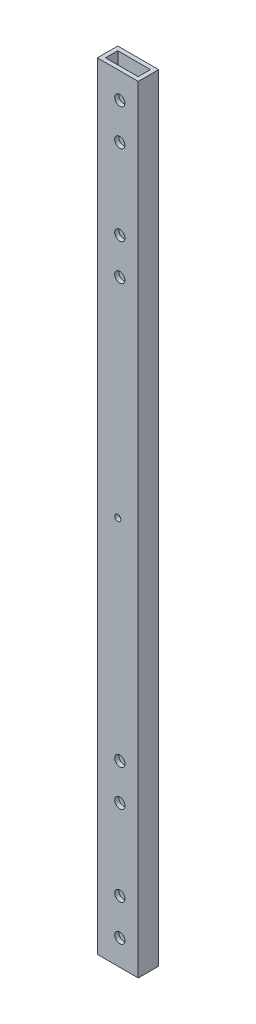
ISO-10303-21;
HEADER;
FILE_DESCRIPTION(('STEP AP214'),'2;1');
FILE_NAME('part.step','',(''),(''),'','','');
FILE_SCHEMA(('AUTOMOTIVE_DESIGN { 1 0 10303 214 1 1 1 1 }'));
ENDSEC;
DATA;
#1=APPLICATION_CONTEXT('core data for automotive mechanical design processes');
#2=APPLICATION_PROTOCOL_DEFINITION('international standard','automotive_design',2000,#1);
#3=PRODUCT_CONTEXT('',#1,'mechanical');
#4=PRODUCT('Part','Part','',(#3));
#5=PRODUCT_RELATED_PRODUCT_CATEGORY('part','',(#4));
#6=PRODUCT_DEFINITION_FORMATION('','',#4);
#7=PRODUCT_DEFINITION_CONTEXT('part definition',#1,'design');
#8=PRODUCT_DEFINITION('design','',#6,#7);
#9=PRODUCT_DEFINITION_SHAPE('','',#8);
#10=(LENGTH_UNIT() NAMED_UNIT(*) SI_UNIT(.MILLI.,.METRE.));
#11=(NAMED_UNIT(*) PLANE_ANGLE_UNIT() SI_UNIT($,.RADIAN.));
#12=(NAMED_UNIT(*) SI_UNIT($,.STERADIAN.) SOLID_ANGLE_UNIT());
#13=UNCERTAINTY_MEASURE_WITH_UNIT(LENGTH_MEASURE(1.E-05),#10,'distance_accuracy_value','');
#14=(GEOMETRIC_REPRESENTATION_CONTEXT(3) GLOBAL_UNCERTAINTY_ASSIGNED_CONTEXT((#13)) GLOBAL_UNIT_ASSIGNED_CONTEXT((#10,
#11,#12)) REPRESENTATION_CONTEXT('',''));
#15=CARTESIAN_POINT('',(0.,0.,0.));
#16=DIRECTION('',(0.,0.,1.));
#17=DIRECTION('',(1.,0.,0.));
#18=AXIS2_PLACEMENT_3D('',#15,#16,#17);
#19=CARTESIAN_POINT('',(0.,190.,0.));
#20=DIRECTION('',(0.,1.,0.));
#21=DIRECTION('',(0.,0.,1.));
#22=AXIS2_PLACEMENT_3D('',#19,#20,#21);
#23=PLANE('',#22);
#24=DIRECTION('',(0.,0.,1.));
#25=VECTOR('',#24,1.);
#26=CARTESIAN_POINT('',(-10.,190.,5.));
#27=LINE('',#26,#25);
#28=CARTESIAN_POINT('',(-10.,190.,-5.));
#29=VERTEX_POINT('',#28);
#30=CARTESIAN_POINT('',(-10.,190.,5.));
#31=VERTEX_POINT('',#30);
#32=EDGE_CURVE('E141',#29,#31,#27,.T.);
#33=ORIENTED_EDGE('',*,*,#32,.T.);
#34=DIRECTION('',(1.,0.,0.));
#35=VECTOR('',#34,1.);
#36=CARTESIAN_POINT('',(10.,190.,5.));
#37=LINE('',#36,#35);
#38=CARTESIAN_POINT('',(10.,190.,5.));
#39=VERTEX_POINT('',#38);
#40=EDGE_CURVE('E144',#31,#39,#37,.T.);
#41=ORIENTED_EDGE('',*,*,#40,.T.);
#42=DIRECTION('',(0.,0.,-1.));
#43=VECTOR('',#42,1.);
#44=CARTESIAN_POINT('',(10.,190.,5.));
#45=LINE('',#44,#43);
#46=CARTESIAN_POINT('',(10.,190.,-5.));
#47=VERTEX_POINT('',#46);
#48=EDGE_CURVE('E147',#39,#47,#45,.T.);
#49=ORIENTED_EDGE('',*,*,#48,.T.);
#50=DIRECTION('',(-1.,0.,0.));
#51=VECTOR('',#50,1.);
#52=CARTESIAN_POINT('',(10.,190.,-5.));
#53=LINE('',#52,#51);
#54=EDGE_CURVE('E149',#47,#29,#53,.T.);
#55=ORIENTED_EDGE('',*,*,#54,.T.);
#56=EDGE_LOOP('',(#33,#41,#49,#55));
#57=FACE_BOUND('',#56,.T.);
#58=DIRECTION('',(-1.,0.,0.));
#59=VECTOR('',#58,1.);
#60=CARTESIAN_POINT('',(8.,190.,-3.));
#61=LINE('',#60,#59);
#62=CARTESIAN_POINT('',(8.,190.,-3.));
#63=VERTEX_POINT('',#62);
#64=CARTESIAN_POINT('',(-8.,190.,-3.));
#65=VERTEX_POINT('',#64);
#66=EDGE_CURVE('E111',#63,#65,#61,.T.);
#67=ORIENTED_EDGE('',*,*,#66,.F.);
#68=DIRECTION('',(0.,0.,-1.));
#69=VECTOR('',#68,1.);
#70=CARTESIAN_POINT('',(8.,190.,3.));
#71=LINE('',#70,#69);
#72=CARTESIAN_POINT('',(8.,190.,3.));
#73=VERTEX_POINT('',#72);
#74=EDGE_CURVE('E103',#73,#63,#71,.T.);
#75=ORIENTED_EDGE('',*,*,#74,.F.);
#76=DIRECTION('',(1.,0.,0.));
#77=VECTOR('',#76,1.);
#78=CARTESIAN_POINT('',(8.,190.,3.));
#79=LINE('',#78,#77);
#80=CARTESIAN_POINT('',(-8.,190.,3.));
#81=VERTEX_POINT('',#80);
#82=EDGE_CURVE('E125',#81,#73,#79,.T.);
#83=ORIENTED_EDGE('',*,*,#82,.F.);
#84=DIRECTION('',(0.,0.,1.));
#85=VECTOR('',#84,1.);
#86=CARTESIAN_POINT('',(-8.,190.,3.));
#87=LINE('',#86,#85);
#88=EDGE_CURVE('E123',#65,#81,#87,.T.);
#89=ORIENTED_EDGE('',*,*,#88,.F.);
#90=EDGE_LOOP('',(#67,#75,#83,#89));
#91=FACE_BOUND('',#90,.T.);
#92=ADVANCED_FACE('F36',(#57,#91),#23,.T.);
#93=CARTESIAN_POINT('',(0.,-190.,0.));
#94=DIRECTION('',(0.,1.,0.));
#95=DIRECTION('',(0.,0.,1.));
#96=AXIS2_PLACEMENT_3D('',#93,#94,#95);
#97=PLANE('',#96);
#98=DIRECTION('',(0.,0.,1.));
#99=VECTOR('',#98,1.);
#100=CARTESIAN_POINT('',(-10.,-190.,5.));
#101=LINE('',#100,#99);
#102=CARTESIAN_POINT('',(-10.,-190.,-5.));
#103=VERTEX_POINT('',#102);
#104=CARTESIAN_POINT('',(-10.,-190.,5.));
#105=VERTEX_POINT('',#104);
#106=EDGE_CURVE('E119',#103,#105,#101,.T.);
#107=ORIENTED_EDGE('',*,*,#106,.F.);
#108=DIRECTION('',(-1.,0.,0.));
#109=VECTOR('',#108,1.);
#110=CARTESIAN_POINT('',(10.,-190.,-5.));
#111=LINE('',#110,#109);
#112=CARTESIAN_POINT('',(10.,-190.,-5.));
#113=VERTEX_POINT('',#112);
#114=EDGE_CURVE('E145',#113,#103,#111,.T.);
#115=ORIENTED_EDGE('',*,*,#114,.F.);
#116=DIRECTION('',(0.,0.,-1.));
#117=VECTOR('',#116,1.);
#118=CARTESIAN_POINT('',(10.,-190.,5.));
#119=LINE('',#118,#117);
#120=CARTESIAN_POINT('',(10.,-190.,5.));
#121=VERTEX_POINT('',#120);
#122=EDGE_CURVE('E156',#121,#113,#119,.T.);
#123=ORIENTED_EDGE('',*,*,#122,.F.);
#124=DIRECTION('',(1.,0.,0.));
#125=VECTOR('',#124,1.);
#126=CARTESIAN_POINT('',(10.,-190.,5.));
#127=LINE('',#126,#125);
#128=EDGE_CURVE('E154',#105,#121,#127,.T.);
#129=ORIENTED_EDGE('',*,*,#128,.F.);
#130=EDGE_LOOP('',(#107,#115,#123,#129));
#131=FACE_BOUND('',#130,.T.);
#132=DIRECTION('',(0.,0.,-1.));
#133=VECTOR('',#132,1.);
#134=CARTESIAN_POINT('',(8.,-190.,3.));
#135=LINE('',#134,#133);
#136=CARTESIAN_POINT('',(8.,-190.,3.));
#137=VERTEX_POINT('',#136);
#138=CARTESIAN_POINT('',(8.,-190.,-3.));
#139=VERTEX_POINT('',#138);
#140=EDGE_CURVE('E61',#137,#139,#135,.T.);
#141=ORIENTED_EDGE('',*,*,#140,.T.);
#142=DIRECTION('',(-1.,0.,0.));
#143=VECTOR('',#142,1.);
#144=CARTESIAN_POINT('',(8.,-190.,-3.));
#145=LINE('',#144,#143);
#146=CARTESIAN_POINT('',(-8.,-190.,-3.));
#147=VERTEX_POINT('',#146);
#148=EDGE_CURVE('E118',#139,#147,#145,.T.);
#149=ORIENTED_EDGE('',*,*,#148,.T.);
#150=DIRECTION('',(0.,0.,1.));
#151=VECTOR('',#150,1.);
#152=CARTESIAN_POINT('',(-8.,-190.,3.));
#153=LINE('',#152,#151);
#154=CARTESIAN_POINT('',(-8.,-190.,3.));
#155=VERTEX_POINT('',#154);
#156=EDGE_CURVE('E133',#147,#155,#153,.T.);
#157=ORIENTED_EDGE('',*,*,#156,.T.);
#158=DIRECTION('',(1.,0.,0.));
#159=VECTOR('',#158,1.);
#160=CARTESIAN_POINT('',(8.,-190.,3.));
#161=LINE('',#160,#159);
#162=EDGE_CURVE('E112',#155,#137,#161,.T.);
#163=ORIENTED_EDGE('',*,*,#162,.T.);
#164=EDGE_LOOP('',(#141,#149,#157,#163));
#165=FACE_BOUND('',#164,.T.);
#166=ADVANCED_FACE('F286',(#131,#165),#97,.F.);
#167=CARTESIAN_POINT('',(-10.,190.,5.));
#168=DIRECTION('',(1.,0.,0.));
#169=DIRECTION('',(0.,0.,-1.));
#170=AXIS2_PLACEMENT_3D('',#167,#168,#169);
#171=PLANE('',#170);
#172=ORIENTED_EDGE('',*,*,#106,.T.);
#173=DIRECTION('',(0.,-1.,0.));
#174=VECTOR('',#173,1.);
#175=CARTESIAN_POINT('',(-10.,190.,5.));
#176=LINE('',#175,#174);
#177=EDGE_CURVE('E11',#31,#105,#176,.T.);
#178=ORIENTED_EDGE('',*,*,#177,.F.);
#179=ORIENTED_EDGE('',*,*,#32,.F.);
#180=DIRECTION('',(0.,-1.,0.));
#181=VECTOR('',#180,1.);
#182=CARTESIAN_POINT('',(-10.,190.,-5.));
#183=LINE('',#182,#181);
#184=EDGE_CURVE('E151',#29,#103,#183,.T.);
#185=ORIENTED_EDGE('',*,*,#184,.T.);
#186=EDGE_LOOP('',(#172,#178,#179,#185));
#187=FACE_BOUND('',#186,.T.);
#188=ADVANCED_FACE('F38',(#187),#171,.F.);
#189=CARTESIAN_POINT('',(10.,190.,5.));
#190=DIRECTION('',(0.,0.,-1.));
#191=DIRECTION('',(-1.,0.,0.));
#192=AXIS2_PLACEMENT_3D('',#189,#190,#191);
#193=PLANE('',#192);
#194=CARTESIAN_POINT('',(0.,0.,5.));
#195=DIRECTION('',(0.,0.,-1.));
#196=DIRECTION('',(-1.,0.,0.));
#197=AXIS2_PLACEMENT_3D('',#194,#195,#196);
#198=CIRCLE('',#197,1.5);
#199=CARTESIAN_POINT('',(-1.5,0.,5.));
#200=VERTEX_POINT('',#199);
#201=EDGE_CURVE('E311',#200,#200,#198,.T.);
#202=ORIENTED_EDGE('',*,*,#201,.T.);
#203=EDGE_LOOP('',(#202));
#204=FACE_BOUND('',#203,.T.);
#205=CARTESIAN_POINT('',(1.,177.5,5.));
#206=DIRECTION('',(0.,0.,1.));
#207=DIRECTION('',(-1.,0.,0.));
#208=AXIS2_PLACEMENT_3D('',#205,#206,#207);
#209=CIRCLE('',#208,2.5);
#210=CARTESIAN_POINT('',(-1.5,177.5,5.));
#211=VERTEX_POINT('',#210);
#212=EDGE_CURVE('E209',#211,#211,#209,.T.);
#213=ORIENTED_EDGE('',*,*,#212,.F.);
#214=EDGE_LOOP('',(#213));
#215=FACE_BOUND('',#214,.T.);
#216=CARTESIAN_POINT('',(1.,159.7,5.));
#217=DIRECTION('',(0.,0.,1.));
#218=DIRECTION('',(-1.,0.,0.));
#219=AXIS2_PLACEMENT_3D('',#216,#217,#218);
#220=CIRCLE('',#219,2.5);
#221=CARTESIAN_POINT('',(-1.5,159.7,5.));
#222=VERTEX_POINT('',#221);
#223=EDGE_CURVE('E206',#222,#222,#220,.T.);
#224=ORIENTED_EDGE('',*,*,#223,.F.);
#225=EDGE_LOOP('',(#224));
#226=FACE_BOUND('',#225,.T.);
#227=CARTESIAN_POINT('',(1.,120.3,5.));
#228=DIRECTION('',(0.,0.,1.));
#229=DIRECTION('',(-1.,0.,0.));
#230=AXIS2_PLACEMENT_3D('',#227,#228,#229);
#231=CIRCLE('',#230,2.5);
#232=CARTESIAN_POINT('',(-1.5,120.3,5.));
#233=VERTEX_POINT('',#232);
#234=EDGE_CURVE('E225',#233,#233,#231,.T.);
#235=ORIENTED_EDGE('',*,*,#234,.F.);
#236=EDGE_LOOP('',(#235));
#237=FACE_BOUND('',#236,.T.);
#238=CARTESIAN_POINT('',(1.,102.5,5.));
#239=DIRECTION('',(0.,0.,1.));
#240=DIRECTION('',(-1.,0.,0.));
#241=AXIS2_PLACEMENT_3D('',#238,#239,#240);
#242=CIRCLE('',#241,2.5);
#243=CARTESIAN_POINT('',(-1.5,102.5,5.));
#244=VERTEX_POINT('',#243);
#245=EDGE_CURVE('E232',#244,#244,#242,.T.);
#246=ORIENTED_EDGE('',*,*,#245,.F.);
#247=EDGE_LOOP('',(#246));
#248=FACE_BOUND('',#247,.T.);
#249=CARTESIAN_POINT('',(1.,-102.5,5.));
#250=DIRECTION('',(0.,0.,1.));
#251=DIRECTION('',(1.,0.,0.));
#252=AXIS2_PLACEMENT_3D('',#249,#250,#251);
#253=CIRCLE('',#252,2.5);
#254=CARTESIAN_POINT('',(3.50000000000001,-102.5,5.));
#255=VERTEX_POINT('',#254);
#256=EDGE_CURVE('E239',#255,#255,#253,.T.);
#257=ORIENTED_EDGE('',*,*,#256,.F.);
#258=EDGE_LOOP('',(#257));
#259=FACE_BOUND('',#258,.T.);
#260=CARTESIAN_POINT('',(1.,-120.3,5.));
#261=DIRECTION('',(0.,0.,1.));
#262=DIRECTION('',(1.,0.,0.));
#263=AXIS2_PLACEMENT_3D('',#260,#261,#262);
#264=CIRCLE('',#263,2.5);
#265=CARTESIAN_POINT('',(3.50000000000001,-120.3,5.));
#266=VERTEX_POINT('',#265);
#267=EDGE_CURVE('E246',#266,#266,#264,.T.);
#268=ORIENTED_EDGE('',*,*,#267,.F.);
#269=EDGE_LOOP('',(#268));
#270=FACE_BOUND('',#269,.T.);
#271=CARTESIAN_POINT('',(1.,-159.7,5.));
#272=DIRECTION('',(0.,0.,1.));
#273=DIRECTION('',(1.,0.,0.));
#274=AXIS2_PLACEMENT_3D('',#271,#272,#273);
#275=CIRCLE('',#274,2.5);
#276=CARTESIAN_POINT('',(3.50000000000001,-159.7,5.));
#277=VERTEX_POINT('',#276);
#278=EDGE_CURVE('E253',#277,#277,#275,.T.);
#279=ORIENTED_EDGE('',*,*,#278,.F.);
#280=EDGE_LOOP('',(#279));
#281=FACE_BOUND('',#280,.T.);
#282=CARTESIAN_POINT('',(1.,-177.5,5.));
#283=DIRECTION('',(0.,0.,1.));
#284=DIRECTION('',(1.,0.,0.));
#285=AXIS2_PLACEMENT_3D('',#282,#283,#284);
#286=CIRCLE('',#285,2.5);
#287=CARTESIAN_POINT('',(3.50000000000001,-177.5,5.));
#288=VERTEX_POINT('',#287);
#289=EDGE_CURVE('E260',#288,#288,#286,.T.);
#290=ORIENTED_EDGE('',*,*,#289,.F.);
#291=EDGE_LOOP('',(#290));
#292=FACE_BOUND('',#291,.T.);
#293=ORIENTED_EDGE('',*,*,#128,.T.);
#294=DIRECTION('',(0.,-1.,0.));
#295=VECTOR('',#294,1.);
#296=CARTESIAN_POINT('',(10.,190.,5.));
#297=LINE('',#296,#295);
#298=EDGE_CURVE('E45',#39,#121,#297,.T.);
#299=ORIENTED_EDGE('',*,*,#298,.F.);
#300=ORIENTED_EDGE('',*,*,#40,.F.);
#301=ORIENTED_EDGE('',*,*,#177,.T.);
#302=EDGE_LOOP('',(#293,#299,#300,#301));
#303=FACE_BOUND('',#302,.T.);
#304=ADVANCED_FACE('F300',(#204,#215,#226,#237,#248,#259,#270,#281,#292,#303),#193,.F.);
#305=CARTESIAN_POINT('',(10.,190.,5.));
#306=DIRECTION('',(-1.,0.,0.));
#307=DIRECTION('',(0.,0.,1.));
#308=AXIS2_PLACEMENT_3D('',#305,#306,#307);
#309=PLANE('',#308);
#310=ORIENTED_EDGE('',*,*,#122,.T.);
#311=DIRECTION('',(0.,-1.,0.));
#312=VECTOR('',#311,1.);
#313=CARTESIAN_POINT('',(10.,190.,-5.));
#314=LINE('',#313,#312);
#315=EDGE_CURVE('E161',#47,#113,#314,.T.);
#316=ORIENTED_EDGE('',*,*,#315,.F.);
#317=ORIENTED_EDGE('',*,*,#48,.F.);
#318=ORIENTED_EDGE('',*,*,#298,.T.);
#319=EDGE_LOOP('',(#310,#316,#317,#318));
#320=FACE_BOUND('',#319,.T.);
#321=ADVANCED_FACE('F297',(#320),#309,.F.);
#322=CARTESIAN_POINT('',(10.,190.,-5.));
#323=DIRECTION('',(0.,0.,1.));
#324=DIRECTION('',(1.,0.,0.));
#325=AXIS2_PLACEMENT_3D('',#322,#323,#324);
#326=PLANE('',#325);
#327=CARTESIAN_POINT('',(0.,0.,-5.));
#328=DIRECTION('',(0.,0.,-1.));
#329=DIRECTION('',(-1.,0.,0.));
#330=AXIS2_PLACEMENT_3D('',#327,#328,#329);
#331=CIRCLE('',#330,1.5);
#332=CARTESIAN_POINT('',(-1.5,0.,-5.));
#333=VERTEX_POINT('',#332);
#334=EDGE_CURVE('E399',#333,#333,#331,.T.);
#335=ORIENTED_EDGE('',*,*,#334,.F.);
#336=EDGE_LOOP('',(#335));
#337=FACE_BOUND('',#336,.T.);
#338=CARTESIAN_POINT('',(1.,177.5,-5.));
#339=DIRECTION('',(0.,0.,1.));
#340=DIRECTION('',(-1.,0.,0.));
#341=AXIS2_PLACEMENT_3D('',#338,#339,#340);
#342=CIRCLE('',#341,2.5);
#343=CARTESIAN_POINT('',(-1.5,177.5,-5.));
#344=VERTEX_POINT('',#343);
#345=EDGE_CURVE('E202',#344,#344,#342,.T.);
#346=ORIENTED_EDGE('',*,*,#345,.T.);
#347=EDGE_LOOP('',(#346));
#348=FACE_BOUND('',#347,.T.);
#349=CARTESIAN_POINT('',(1.,159.7,-5.));
#350=DIRECTION('',(0.,0.,1.));
#351=DIRECTION('',(-1.,0.,0.));
#352=AXIS2_PLACEMENT_3D('',#349,#350,#351);
#353=CIRCLE('',#352,2.5);
#354=CARTESIAN_POINT('',(-1.5,159.7,-5.));
#355=VERTEX_POINT('',#354);
#356=EDGE_CURVE('E198',#355,#355,#353,.T.);
#357=ORIENTED_EDGE('',*,*,#356,.T.);
#358=EDGE_LOOP('',(#357));
#359=FACE_BOUND('',#358,.T.);
#360=CARTESIAN_POINT('',(1.,120.3,-5.));
#361=DIRECTION('',(0.,0.,1.));
#362=DIRECTION('',(-1.,0.,0.));
#363=AXIS2_PLACEMENT_3D('',#360,#361,#362);
#364=CIRCLE('',#363,2.5);
#365=CARTESIAN_POINT('',(-1.5,120.3,-5.));
#366=VERTEX_POINT('',#365);
#367=EDGE_CURVE('E194',#366,#366,#364,.T.);
#368=ORIENTED_EDGE('',*,*,#367,.T.);
#369=EDGE_LOOP('',(#368));
#370=FACE_BOUND('',#369,.T.);
#371=CARTESIAN_POINT('',(1.,102.5,-5.));
#372=DIRECTION('',(0.,0.,1.));
#373=DIRECTION('',(-1.,0.,0.));
#374=AXIS2_PLACEMENT_3D('',#371,#372,#373);
#375=CIRCLE('',#374,2.5);
#376=CARTESIAN_POINT('',(-1.5,102.5,-5.));
#377=VERTEX_POINT('',#376);
#378=EDGE_CURVE('E189',#377,#377,#375,.T.);
#379=ORIENTED_EDGE('',*,*,#378,.T.);
#380=EDGE_LOOP('',(#379));
#381=FACE_BOUND('',#380,.T.);
#382=CARTESIAN_POINT('',(1.,-102.5,-5.));
#383=DIRECTION('',(0.,0.,1.));
#384=DIRECTION('',(1.,0.,0.));
#385=AXIS2_PLACEMENT_3D('',#382,#383,#384);
#386=CIRCLE('',#385,2.5);
#387=CARTESIAN_POINT('',(3.50000000000001,-102.5,-5.));
#388=VERTEX_POINT('',#387);
#389=EDGE_CURVE('E184',#388,#388,#386,.T.);
#390=ORIENTED_EDGE('',*,*,#389,.T.);
#391=EDGE_LOOP('',(#390));
#392=FACE_BOUND('',#391,.T.);
#393=CARTESIAN_POINT('',(1.,-120.3,-5.));
#394=DIRECTION('',(0.,0.,1.));
#395=DIRECTION('',(1.,0.,0.));
#396=AXIS2_PLACEMENT_3D('',#393,#394,#395);
#397=CIRCLE('',#396,2.5);
#398=CARTESIAN_POINT('',(3.50000000000001,-120.3,-5.));
#399=VERTEX_POINT('',#398);
#400=EDGE_CURVE('E179',#399,#399,#397,.T.);
#401=ORIENTED_EDGE('',*,*,#400,.T.);
#402=EDGE_LOOP('',(#401));
#403=FACE_BOUND('',#402,.T.);
#404=CARTESIAN_POINT('',(1.,-159.7,-5.));
#405=DIRECTION('',(0.,0.,1.));
#406=DIRECTION('',(1.,0.,0.));
#407=AXIS2_PLACEMENT_3D('',#404,#405,#406);
#408=CIRCLE('',#407,2.5);
#409=CARTESIAN_POINT('',(3.50000000000001,-159.7,-5.));
#410=VERTEX_POINT('',#409);
#411=EDGE_CURVE('E174',#410,#410,#408,.T.);
#412=ORIENTED_EDGE('',*,*,#411,.T.);
#413=EDGE_LOOP('',(#412));
#414=FACE_BOUND('',#413,.T.);
#415=CARTESIAN_POINT('',(1.,-177.5,-5.));
#416=DIRECTION('',(0.,0.,1.));
#417=DIRECTION('',(1.,0.,0.));
#418=AXIS2_PLACEMENT_3D('',#415,#416,#417);
#419=CIRCLE('',#418,2.5);
#420=CARTESIAN_POINT('',(3.50000000000001,-177.5,-5.));
#421=VERTEX_POINT('',#420);
#422=EDGE_CURVE('E169',#421,#421,#419,.T.);
#423=ORIENTED_EDGE('',*,*,#422,.T.);
#424=EDGE_LOOP('',(#423));
#425=FACE_BOUND('',#424,.T.);
#426=ORIENTED_EDGE('',*,*,#114,.T.);
#427=ORIENTED_EDGE('',*,*,#184,.F.);
#428=ORIENTED_EDGE('',*,*,#54,.F.);
#429=ORIENTED_EDGE('',*,*,#315,.T.);
#430=EDGE_LOOP('',(#426,#427,#428,#429));
#431=FACE_BOUND('',#430,.T.);
#432=ADVANCED_FACE('F281',(#337,#348,#359,#370,#381,#392,#403,#414,#425,#431),#326,.F.);
#433=CARTESIAN_POINT('',(8.,190.,3.));
#434=DIRECTION('',(-1.,0.,0.));
#435=DIRECTION('',(0.,0.,1.));
#436=AXIS2_PLACEMENT_3D('',#433,#434,#435);
#437=PLANE('',#436);
#438=ORIENTED_EDGE('',*,*,#140,.F.);
#439=DIRECTION('',(0.,-1.,0.));
#440=VECTOR('',#439,1.);
#441=CARTESIAN_POINT('',(8.,190.,3.));
#442=LINE('',#441,#440);
#443=EDGE_CURVE('E107',#73,#137,#442,.T.);
#444=ORIENTED_EDGE('',*,*,#443,.F.);
#445=ORIENTED_EDGE('',*,*,#74,.T.);
#446=DIRECTION('',(0.,-1.,0.));
#447=VECTOR('',#446,1.);
#448=CARTESIAN_POINT('',(8.,190.,-3.));
#449=LINE('',#448,#447);
#450=EDGE_CURVE('E106',#63,#139,#449,.T.);
#451=ORIENTED_EDGE('',*,*,#450,.T.);
#452=EDGE_LOOP('',(#438,#444,#445,#451));
#453=FACE_BOUND('',#452,.T.);
#454=ADVANCED_FACE('F105',(#453),#437,.T.);
#455=CARTESIAN_POINT('',(8.,190.,-3.));
#456=DIRECTION('',(0.,0.,1.));
#457=DIRECTION('',(1.,0.,0.));
#458=AXIS2_PLACEMENT_3D('',#455,#456,#457);
#459=PLANE('',#458);
#460=CARTESIAN_POINT('',(0.,0.,-3.));
#461=DIRECTION('',(0.,0.,1.));
#462=DIRECTION('',(1.,0.,0.));
#463=AXIS2_PLACEMENT_3D('',#460,#461,#462);
#464=CIRCLE('',#463,1.5);
#465=CARTESIAN_POINT('',(-1.5,0.,-3.));
#466=VERTEX_POINT('',#465);
#467=EDGE_CURVE('E214',#466,#466,#464,.T.);
#468=ORIENTED_EDGE('',*,*,#467,.F.);
#469=EDGE_LOOP('',(#468));
#470=FACE_BOUND('',#469,.T.);
#471=CARTESIAN_POINT('',(1.,177.5,-3.));
#472=DIRECTION('',(0.,0.,1.));
#473=DIRECTION('',(1.,0.,0.));
#474=AXIS2_PLACEMENT_3D('',#471,#472,#473);
#475=CIRCLE('',#474,2.5);
#476=CARTESIAN_POINT('',(3.50000000000001,177.5,-3.));
#477=VERTEX_POINT('',#476);
#478=EDGE_CURVE('E201',#477,#477,#475,.T.);
#479=ORIENTED_EDGE('',*,*,#478,.F.);
#480=EDGE_LOOP('',(#479));
#481=FACE_BOUND('',#480,.T.);
#482=CARTESIAN_POINT('',(1.,159.7,-3.));
#483=DIRECTION('',(0.,0.,1.));
#484=DIRECTION('',(1.,0.,0.));
#485=AXIS2_PLACEMENT_3D('',#482,#483,#484);
#486=CIRCLE('',#485,2.5);
#487=CARTESIAN_POINT('',(3.50000000000001,159.7,-3.));
#488=VERTEX_POINT('',#487);
#489=EDGE_CURVE('E197',#488,#488,#486,.T.);
#490=ORIENTED_EDGE('',*,*,#489,.F.);
#491=EDGE_LOOP('',(#490));
#492=FACE_BOUND('',#491,.T.);
#493=CARTESIAN_POINT('',(1.,120.3,-3.));
#494=DIRECTION('',(0.,0.,1.));
#495=DIRECTION('',(1.,0.,0.));
#496=AXIS2_PLACEMENT_3D('',#493,#494,#495);
#497=CIRCLE('',#496,2.5);
#498=CARTESIAN_POINT('',(3.50000000000001,120.3,-3.));
#499=VERTEX_POINT('',#498);
#500=EDGE_CURVE('E193',#499,#499,#497,.T.);
#501=ORIENTED_EDGE('',*,*,#500,.F.);
#502=EDGE_LOOP('',(#501));
#503=FACE_BOUND('',#502,.T.);
#504=CARTESIAN_POINT('',(1.,102.5,-3.));
#505=DIRECTION('',(0.,0.,1.));
#506=DIRECTION('',(1.,0.,0.));
#507=AXIS2_PLACEMENT_3D('',#504,#505,#506);
#508=CIRCLE('',#507,2.5);
#509=CARTESIAN_POINT('',(3.50000000000001,102.5,-3.));
#510=VERTEX_POINT('',#509);
#511=EDGE_CURVE('E188',#510,#510,#508,.T.);
#512=ORIENTED_EDGE('',*,*,#511,.F.);
#513=EDGE_LOOP('',(#512));
#514=FACE_BOUND('',#513,.T.);
#515=CARTESIAN_POINT('',(1.,-102.5,-3.));
#516=DIRECTION('',(0.,0.,1.));
#517=DIRECTION('',(1.,0.,0.));
#518=AXIS2_PLACEMENT_3D('',#515,#516,#517);
#519=CIRCLE('',#518,2.5);
#520=CARTESIAN_POINT('',(3.50000000000001,-102.5,-3.));
#521=VERTEX_POINT('',#520);
#522=EDGE_CURVE('E183',#521,#521,#519,.T.);
#523=ORIENTED_EDGE('',*,*,#522,.F.);
#524=EDGE_LOOP('',(#523));
#525=FACE_BOUND('',#524,.T.);
#526=CARTESIAN_POINT('',(1.,-120.3,-3.));
#527=DIRECTION('',(0.,0.,1.));
#528=DIRECTION('',(1.,0.,0.));
#529=AXIS2_PLACEMENT_3D('',#526,#527,#528);
#530=CIRCLE('',#529,2.5);
#531=CARTESIAN_POINT('',(3.50000000000001,-120.3,-3.));
#532=VERTEX_POINT('',#531);
#533=EDGE_CURVE('E178',#532,#532,#530,.T.);
#534=ORIENTED_EDGE('',*,*,#533,.F.);
#535=EDGE_LOOP('',(#534));
#536=FACE_BOUND('',#535,.T.);
#537=CARTESIAN_POINT('',(1.,-159.7,-3.));
#538=DIRECTION('',(0.,0.,1.));
#539=DIRECTION('',(1.,0.,0.));
#540=AXIS2_PLACEMENT_3D('',#537,#538,#539);
#541=CIRCLE('',#540,2.5);
#542=CARTESIAN_POINT('',(3.50000000000001,-159.7,-3.));
#543=VERTEX_POINT('',#542);
#544=EDGE_CURVE('E173',#543,#543,#541,.T.);
#545=ORIENTED_EDGE('',*,*,#544,.F.);
#546=EDGE_LOOP('',(#545));
#547=FACE_BOUND('',#546,.T.);
#548=CARTESIAN_POINT('',(1.,-177.5,-3.));
#549=DIRECTION('',(0.,0.,1.));
#550=DIRECTION('',(1.,0.,0.));
#551=AXIS2_PLACEMENT_3D('',#548,#549,#550);
#552=CIRCLE('',#551,2.5);
#553=CARTESIAN_POINT('',(3.50000000000001,-177.5,-3.));
#554=VERTEX_POINT('',#553);
#555=EDGE_CURVE('E131',#554,#554,#552,.T.);
#556=ORIENTED_EDGE('',*,*,#555,.F.);
#557=EDGE_LOOP('',(#556));
#558=FACE_BOUND('',#557,.T.);
#559=ORIENTED_EDGE('',*,*,#148,.F.);
#560=ORIENTED_EDGE('',*,*,#450,.F.);
#561=ORIENTED_EDGE('',*,*,#66,.T.);
#562=DIRECTION('',(0.,-1.,0.));
#563=VECTOR('',#562,1.);
#564=CARTESIAN_POINT('',(-8.,190.,-3.));
#565=LINE('',#564,#563);
#566=EDGE_CURVE('E120',#65,#147,#565,.T.);
#567=ORIENTED_EDGE('',*,*,#566,.T.);
#568=EDGE_LOOP('',(#559,#560,#561,#567));
#569=FACE_BOUND('',#568,.T.);
#570=ADVANCED_FACE('F115',(#470,#481,#492,#503,#514,#525,#536,#547,#558,#569),#459,.T.);
#571=CARTESIAN_POINT('',(-8.,190.,3.));
#572=DIRECTION('',(1.,0.,0.));
#573=DIRECTION('',(0.,0.,-1.));
#574=AXIS2_PLACEMENT_3D('',#571,#572,#573);
#575=PLANE('',#574);
#576=ORIENTED_EDGE('',*,*,#156,.F.);
#577=ORIENTED_EDGE('',*,*,#566,.F.);
#578=ORIENTED_EDGE('',*,*,#88,.T.);
#579=DIRECTION('',(0.,-1.,0.));
#580=VECTOR('',#579,1.);
#581=CARTESIAN_POINT('',(-8.,190.,3.));
#582=LINE('',#581,#580);
#583=EDGE_CURVE('E53',#81,#155,#582,.T.);
#584=ORIENTED_EDGE('',*,*,#583,.T.);
#585=EDGE_LOOP('',(#576,#577,#578,#584));
#586=FACE_BOUND('',#585,.T.);
#587=ADVANCED_FACE('F271',(#586),#575,.T.);
#588=CARTESIAN_POINT('',(8.,190.,3.));
#589=DIRECTION('',(0.,0.,-1.));
#590=DIRECTION('',(-1.,0.,0.));
#591=AXIS2_PLACEMENT_3D('',#588,#589,#590);
#592=PLANE('',#591);
#593=CARTESIAN_POINT('',(0.,0.,3.));
#594=DIRECTION('',(0.,0.,-1.));
#595=DIRECTION('',(-1.,0.,0.));
#596=AXIS2_PLACEMENT_3D('',#593,#594,#595);
#597=CIRCLE('',#596,1.5);
#598=CARTESIAN_POINT('',(-1.5,0.,3.));
#599=VERTEX_POINT('',#598);
#600=EDGE_CURVE('E40',#599,#599,#597,.T.);
#601=ORIENTED_EDGE('',*,*,#600,.F.);
#602=EDGE_LOOP('',(#601));
#603=FACE_BOUND('',#602,.T.);
#604=CARTESIAN_POINT('',(1.,177.5,3.));
#605=DIRECTION('',(0.,0.,-1.));
#606=DIRECTION('',(-1.,0.,0.));
#607=AXIS2_PLACEMENT_3D('',#604,#605,#606);
#608=CIRCLE('',#607,2.5);
#609=CARTESIAN_POINT('',(-1.5,177.5,3.));
#610=VERTEX_POINT('',#609);
#611=EDGE_CURVE('E199',#610,#610,#608,.T.);
#612=ORIENTED_EDGE('',*,*,#611,.F.);
#613=EDGE_LOOP('',(#612));
#614=FACE_BOUND('',#613,.T.);
#615=CARTESIAN_POINT('',(1.,159.7,3.));
#616=DIRECTION('',(0.,0.,-1.));
#617=DIRECTION('',(-1.,0.,0.));
#618=AXIS2_PLACEMENT_3D('',#615,#616,#617);
#619=CIRCLE('',#618,2.5);
#620=CARTESIAN_POINT('',(-1.5,159.7,3.));
#621=VERTEX_POINT('',#620);
#622=EDGE_CURVE('E195',#621,#621,#619,.T.);
#623=ORIENTED_EDGE('',*,*,#622,.F.);
#624=EDGE_LOOP('',(#623));
#625=FACE_BOUND('',#624,.T.);
#626=CARTESIAN_POINT('',(1.,120.3,3.));
#627=DIRECTION('',(0.,0.,-1.));
#628=DIRECTION('',(-1.,0.,0.));
#629=AXIS2_PLACEMENT_3D('',#626,#627,#628);
#630=CIRCLE('',#629,2.5);
#631=CARTESIAN_POINT('',(-1.5,120.3,3.));
#632=VERTEX_POINT('',#631);
#633=EDGE_CURVE('E190',#632,#632,#630,.T.);
#634=ORIENTED_EDGE('',*,*,#633,.F.);
#635=EDGE_LOOP('',(#634));
#636=FACE_BOUND('',#635,.T.);
#637=CARTESIAN_POINT('',(1.,102.5,3.));
#638=DIRECTION('',(0.,0.,-1.));
#639=DIRECTION('',(-1.,0.,0.));
#640=AXIS2_PLACEMENT_3D('',#637,#638,#639);
#641=CIRCLE('',#640,2.5);
#642=CARTESIAN_POINT('',(-1.5,102.5,3.));
#643=VERTEX_POINT('',#642);
#644=EDGE_CURVE('E185',#643,#643,#641,.T.);
#645=ORIENTED_EDGE('',*,*,#644,.F.);
#646=EDGE_LOOP('',(#645));
#647=FACE_BOUND('',#646,.T.);
#648=CARTESIAN_POINT('',(1.,-102.5,3.));
#649=DIRECTION('',(0.,0.,-1.));
#650=DIRECTION('',(-1.,0.,0.));
#651=AXIS2_PLACEMENT_3D('',#648,#649,#650);
#652=CIRCLE('',#651,2.5);
#653=CARTESIAN_POINT('',(-1.5,-102.5,3.));
#654=VERTEX_POINT('',#653);
#655=EDGE_CURVE('E180',#654,#654,#652,.T.);
#656=ORIENTED_EDGE('',*,*,#655,.F.);
#657=EDGE_LOOP('',(#656));
#658=FACE_BOUND('',#657,.T.);
#659=CARTESIAN_POINT('',(1.,-120.3,3.));
#660=DIRECTION('',(0.,0.,-1.));
#661=DIRECTION('',(-1.,0.,0.));
#662=AXIS2_PLACEMENT_3D('',#659,#660,#661);
#663=CIRCLE('',#662,2.5);
#664=CARTESIAN_POINT('',(-1.5,-120.3,3.));
#665=VERTEX_POINT('',#664);
#666=EDGE_CURVE('E175',#665,#665,#663,.T.);
#667=ORIENTED_EDGE('',*,*,#666,.F.);
#668=EDGE_LOOP('',(#667));
#669=FACE_BOUND('',#668,.T.);
#670=CARTESIAN_POINT('',(1.,-159.7,3.));
#671=DIRECTION('',(0.,0.,-1.));
#672=DIRECTION('',(-1.,0.,0.));
#673=AXIS2_PLACEMENT_3D('',#670,#671,#672);
#674=CIRCLE('',#673,2.5);
#675=CARTESIAN_POINT('',(-1.5,-159.7,3.));
#676=VERTEX_POINT('',#675);
#677=EDGE_CURVE('E170',#676,#676,#674,.T.);
#678=ORIENTED_EDGE('',*,*,#677,.F.);
#679=EDGE_LOOP('',(#678));
#680=FACE_BOUND('',#679,.T.);
#681=CARTESIAN_POINT('',(1.,-177.5,3.));
#682=DIRECTION('',(0.,0.,-1.));
#683=DIRECTION('',(-1.,0.,0.));
#684=AXIS2_PLACEMENT_3D('',#681,#682,#683);
#685=CIRCLE('',#684,2.5);
#686=CARTESIAN_POINT('',(-1.5,-177.5,3.));
#687=VERTEX_POINT('',#686);
#688=EDGE_CURVE('E166',#687,#687,#685,.T.);
#689=ORIENTED_EDGE('',*,*,#688,.F.);
#690=EDGE_LOOP('',(#689));
#691=FACE_BOUND('',#690,.T.);
#692=ORIENTED_EDGE('',*,*,#162,.F.);
#693=ORIENTED_EDGE('',*,*,#583,.F.);
#694=ORIENTED_EDGE('',*,*,#82,.T.);
#695=ORIENTED_EDGE('',*,*,#443,.T.);
#696=EDGE_LOOP('',(#692,#693,#694,#695));
#697=FACE_BOUND('',#696,.T.);
#698=ADVANCED_FACE('F278',(#603,#614,#625,#636,#647,#658,#669,#680,#691,#697),#592,.T.);
#699=CARTESIAN_POINT('',(1.,-177.5,-5.));
#700=DIRECTION('',(0.,0.,1.));
#701=DIRECTION('',(1.,0.,0.));
#702=AXIS2_PLACEMENT_3D('',#699,#700,#701);
#703=CYLINDRICAL_SURFACE('',#702,2.5);
#704=ORIENTED_EDGE('',*,*,#688,.T.);
#705=EDGE_LOOP('',(#704));
#706=FACE_BOUND('',#705,.T.);
#707=ORIENTED_EDGE('',*,*,#289,.T.);
#708=EDGE_LOOP('',(#707));
#709=FACE_BOUND('',#708,.T.);
#710=ADVANCED_FACE('F342',(#706,#709),#703,.F.);
#711=ORIENTED_EDGE('',*,*,#555,.T.);
#712=EDGE_LOOP('',(#711));
#713=FACE_BOUND('',#712,.T.);
#714=ORIENTED_EDGE('',*,*,#422,.F.);
#715=EDGE_LOOP('',(#714));
#716=FACE_BOUND('',#715,.T.);
#717=ADVANCED_FACE('F267',(#713,#716),#703,.F.);
#718=CARTESIAN_POINT('',(1.,-159.7,-5.));
#719=DIRECTION('',(0.,0.,1.));
#720=DIRECTION('',(1.,0.,0.));
#721=AXIS2_PLACEMENT_3D('',#718,#719,#720);
#722=CYLINDRICAL_SURFACE('',#721,2.5);
#723=ORIENTED_EDGE('',*,*,#677,.T.);
#724=EDGE_LOOP('',(#723));
#725=FACE_BOUND('',#724,.T.);
#726=ORIENTED_EDGE('',*,*,#278,.T.);
#727=EDGE_LOOP('',(#726));
#728=FACE_BOUND('',#727,.T.);
#729=ADVANCED_FACE('F353',(#725,#728),#722,.F.);
#730=ORIENTED_EDGE('',*,*,#544,.T.);
#731=EDGE_LOOP('',(#730));
#732=FACE_BOUND('',#731,.T.);
#733=ORIENTED_EDGE('',*,*,#411,.F.);
#734=EDGE_LOOP('',(#733));
#735=FACE_BOUND('',#734,.T.);
#736=ADVANCED_FACE('F356',(#732,#735),#722,.F.);
#737=CARTESIAN_POINT('',(1.,-120.3,-5.));
#738=DIRECTION('',(0.,0.,1.));
#739=DIRECTION('',(1.,0.,0.));
#740=AXIS2_PLACEMENT_3D('',#737,#738,#739);
#741=CYLINDRICAL_SURFACE('',#740,2.5);
#742=ORIENTED_EDGE('',*,*,#666,.T.);
#743=EDGE_LOOP('',(#742));
#744=FACE_BOUND('',#743,.T.);
#745=ORIENTED_EDGE('',*,*,#267,.T.);
#746=EDGE_LOOP('',(#745));
#747=FACE_BOUND('',#746,.T.);
#748=ADVANCED_FACE('F358',(#744,#747),#741,.F.);
#749=ORIENTED_EDGE('',*,*,#533,.T.);
#750=EDGE_LOOP('',(#749));
#751=FACE_BOUND('',#750,.T.);
#752=ORIENTED_EDGE('',*,*,#400,.F.);
#753=EDGE_LOOP('',(#752));
#754=FACE_BOUND('',#753,.T.);
#755=ADVANCED_FACE('F361',(#751,#754),#741,.F.);
#756=CARTESIAN_POINT('',(1.,-102.5,-5.));
#757=DIRECTION('',(0.,0.,1.));
#758=DIRECTION('',(1.,0.,0.));
#759=AXIS2_PLACEMENT_3D('',#756,#757,#758);
#760=CYLINDRICAL_SURFACE('',#759,2.5);
#761=ORIENTED_EDGE('',*,*,#655,.T.);
#762=EDGE_LOOP('',(#761));
#763=FACE_BOUND('',#762,.T.);
#764=ORIENTED_EDGE('',*,*,#256,.T.);
#765=EDGE_LOOP('',(#764));
#766=FACE_BOUND('',#765,.T.);
#767=ADVANCED_FACE('F363',(#763,#766),#760,.F.);
#768=ORIENTED_EDGE('',*,*,#522,.T.);
#769=EDGE_LOOP('',(#768));
#770=FACE_BOUND('',#769,.T.);
#771=ORIENTED_EDGE('',*,*,#389,.F.);
#772=EDGE_LOOP('',(#771));
#773=FACE_BOUND('',#772,.T.);
#774=ADVANCED_FACE('F366',(#770,#773),#760,.F.);
#775=CARTESIAN_POINT('',(1.,102.5,-5.));
#776=DIRECTION('',(0.,0.,1.));
#777=DIRECTION('',(1.,0.,0.));
#778=AXIS2_PLACEMENT_3D('',#775,#776,#777);
#779=CYLINDRICAL_SURFACE('',#778,2.5);
#780=ORIENTED_EDGE('',*,*,#644,.T.);
#781=EDGE_LOOP('',(#780));
#782=FACE_BOUND('',#781,.T.);
#783=ORIENTED_EDGE('',*,*,#245,.T.);
#784=EDGE_LOOP('',(#783));
#785=FACE_BOUND('',#784,.T.);
#786=ADVANCED_FACE('F368',(#782,#785),#779,.F.);
#787=ORIENTED_EDGE('',*,*,#511,.T.);
#788=EDGE_LOOP('',(#787));
#789=FACE_BOUND('',#788,.T.);
#790=ORIENTED_EDGE('',*,*,#378,.F.);
#791=EDGE_LOOP('',(#790));
#792=FACE_BOUND('',#791,.T.);
#793=ADVANCED_FACE('F371',(#789,#792),#779,.F.);
#794=CARTESIAN_POINT('',(1.,120.3,-5.));
#795=DIRECTION('',(0.,0.,1.));
#796=DIRECTION('',(1.,0.,0.));
#797=AXIS2_PLACEMENT_3D('',#794,#795,#796);
#798=CYLINDRICAL_SURFACE('',#797,2.5);
#799=ORIENTED_EDGE('',*,*,#633,.T.);
#800=EDGE_LOOP('',(#799));
#801=FACE_BOUND('',#800,.T.);
#802=ORIENTED_EDGE('',*,*,#234,.T.);
#803=EDGE_LOOP('',(#802));
#804=FACE_BOUND('',#803,.T.);
#805=ADVANCED_FACE('F373',(#801,#804),#798,.F.);
#806=ORIENTED_EDGE('',*,*,#500,.T.);
#807=EDGE_LOOP('',(#806));
#808=FACE_BOUND('',#807,.T.);
#809=ORIENTED_EDGE('',*,*,#367,.F.);
#810=EDGE_LOOP('',(#809));
#811=FACE_BOUND('',#810,.T.);
#812=ADVANCED_FACE('F376',(#808,#811),#798,.F.);
#813=CARTESIAN_POINT('',(1.,159.7,-5.));
#814=DIRECTION('',(0.,0.,1.));
#815=DIRECTION('',(1.,0.,0.));
#816=AXIS2_PLACEMENT_3D('',#813,#814,#815);
#817=CYLINDRICAL_SURFACE('',#816,2.5);
#818=ORIENTED_EDGE('',*,*,#622,.T.);
#819=EDGE_LOOP('',(#818));
#820=FACE_BOUND('',#819,.T.);
#821=ORIENTED_EDGE('',*,*,#223,.T.);
#822=EDGE_LOOP('',(#821));
#823=FACE_BOUND('',#822,.T.);
#824=ADVANCED_FACE('F378',(#820,#823),#817,.F.);
#825=ORIENTED_EDGE('',*,*,#489,.T.);
#826=EDGE_LOOP('',(#825));
#827=FACE_BOUND('',#826,.T.);
#828=ORIENTED_EDGE('',*,*,#356,.F.);
#829=EDGE_LOOP('',(#828));
#830=FACE_BOUND('',#829,.T.);
#831=ADVANCED_FACE('F381',(#827,#830),#817,.F.);
#832=CARTESIAN_POINT('',(1.,177.5,-5.));
#833=DIRECTION('',(0.,0.,1.));
#834=DIRECTION('',(1.,0.,0.));
#835=AXIS2_PLACEMENT_3D('',#832,#833,#834);
#836=CYLINDRICAL_SURFACE('',#835,2.5);
#837=ORIENTED_EDGE('',*,*,#611,.T.);
#838=EDGE_LOOP('',(#837));
#839=FACE_BOUND('',#838,.T.);
#840=ORIENTED_EDGE('',*,*,#212,.T.);
#841=EDGE_LOOP('',(#840));
#842=FACE_BOUND('',#841,.T.);
#843=ADVANCED_FACE('F383',(#839,#842),#836,.F.);
#844=ORIENTED_EDGE('',*,*,#478,.T.);
#845=EDGE_LOOP('',(#844));
#846=FACE_BOUND('',#845,.T.);
#847=ORIENTED_EDGE('',*,*,#345,.F.);
#848=EDGE_LOOP('',(#847));
#849=FACE_BOUND('',#848,.T.);
#850=ADVANCED_FACE('F386',(#846,#849),#836,.F.);
#851=CARTESIAN_POINT('',(0.,0.,5.));
#852=DIRECTION('',(0.,0.,-1.));
#853=DIRECTION('',(-1.,0.,0.));
#854=AXIS2_PLACEMENT_3D('',#851,#852,#853);
#855=CYLINDRICAL_SURFACE('',#854,1.5);
#856=CARTESIAN_POINT('',(-1.5,0.,3.));
#857=CARTESIAN_POINT('',(-1.5,0.,3.02083333333333));
#858=CARTESIAN_POINT('',(-1.5,0.,3.04166666666667));
#859=CARTESIAN_POINT('',(-1.5,0.,3.08333333333333));
#860=CARTESIAN_POINT('',(-1.5,0.,3.10416666666667));
#861=CARTESIAN_POINT('',(-1.5,0.,3.14583333333333));
#862=CARTESIAN_POINT('',(-1.5,0.,3.16666666666667));
#863=CARTESIAN_POINT('',(-1.5,0.,3.20833333333333));
#864=CARTESIAN_POINT('',(-1.5,0.,3.22916666666667));
#865=CARTESIAN_POINT('',(-1.5,0.,3.27083333333333));
#866=CARTESIAN_POINT('',(-1.5,0.,3.29166666666667));
#867=CARTESIAN_POINT('',(-1.5,0.,3.33333333333333));
#868=CARTESIAN_POINT('',(-1.5,0.,3.35416666666667));
#869=CARTESIAN_POINT('',(-1.5,0.,3.39583333333333));
#870=CARTESIAN_POINT('',(-1.5,0.,3.41666666666667));
#871=CARTESIAN_POINT('',(-1.5,0.,3.45833333333333));
#872=CARTESIAN_POINT('',(-1.5,0.,3.47916666666667));
#873=CARTESIAN_POINT('',(-1.5,0.,3.52083333333333));
#874=CARTESIAN_POINT('',(-1.5,0.,3.54166666666667));
#875=CARTESIAN_POINT('',(-1.5,0.,3.58333333333333));
#876=CARTESIAN_POINT('',(-1.5,0.,3.60416666666667));
#877=CARTESIAN_POINT('',(-1.5,0.,3.64583333333333));
#878=CARTESIAN_POINT('',(-1.5,0.,3.66666666666667));
#879=CARTESIAN_POINT('',(-1.5,0.,3.70833333333333));
#880=CARTESIAN_POINT('',(-1.5,0.,3.72916666666667));
#881=CARTESIAN_POINT('',(-1.5,0.,3.77083333333333));
#882=CARTESIAN_POINT('',(-1.5,0.,3.79166666666667));
#883=CARTESIAN_POINT('',(-1.5,0.,3.83333333333333));
#884=CARTESIAN_POINT('',(-1.5,0.,3.85416666666667));
#885=CARTESIAN_POINT('',(-1.5,0.,3.89583333333333));
#886=CARTESIAN_POINT('',(-1.5,0.,3.91666666666667));
#887=CARTESIAN_POINT('',(-1.5,0.,3.95833333333334));
#888=CARTESIAN_POINT('',(-1.5,0.,3.97916666666667));
#889=CARTESIAN_POINT('',(-1.5,0.,4.02083333333334));
#890=CARTESIAN_POINT('',(-1.5,0.,4.04166666666667));
#891=CARTESIAN_POINT('',(-1.5,0.,4.08333333333334));
#892=CARTESIAN_POINT('',(-1.5,0.,4.10416666666667));
#893=CARTESIAN_POINT('',(-1.5,0.,4.14583333333334));
#894=CARTESIAN_POINT('',(-1.5,0.,4.16666666666667));
#895=CARTESIAN_POINT('',(-1.5,0.,4.20833333333334));
#896=CARTESIAN_POINT('',(-1.5,0.,4.22916666666667));
#897=CARTESIAN_POINT('',(-1.5,0.,4.27083333333334));
#898=CARTESIAN_POINT('',(-1.5,0.,4.29166666666667));
#899=CARTESIAN_POINT('',(-1.5,0.,4.33333333333334));
#900=CARTESIAN_POINT('',(-1.5,0.,4.35416666666667));
#901=CARTESIAN_POINT('',(-1.5,0.,4.39583333333334));
#902=CARTESIAN_POINT('',(-1.5,0.,4.41666666666667));
#903=CARTESIAN_POINT('',(-1.5,0.,4.45833333333334));
#904=CARTESIAN_POINT('',(-1.5,0.,4.47916666666667));
#905=CARTESIAN_POINT('',(-1.5,0.,4.52083333333334));
#906=CARTESIAN_POINT('',(-1.5,0.,4.54166666666667));
#907=CARTESIAN_POINT('',(-1.5,0.,4.58333333333334));
#908=CARTESIAN_POINT('',(-1.5,0.,4.60416666666667));
#909=CARTESIAN_POINT('',(-1.5,0.,4.64583333333334));
#910=CARTESIAN_POINT('',(-1.5,0.,4.66666666666667));
#911=CARTESIAN_POINT('',(-1.5,0.,4.70833333333334));
#912=CARTESIAN_POINT('',(-1.5,0.,4.72916666666667));
#913=CARTESIAN_POINT('',(-1.5,0.,4.77083333333334));
#914=CARTESIAN_POINT('',(-1.5,0.,4.79166666666667));
#915=CARTESIAN_POINT('',(-1.5,0.,4.83333333333334));
#916=CARTESIAN_POINT('',(-1.5,0.,4.85416666666667));
#917=CARTESIAN_POINT('',(-1.5,0.,4.89583333333334));
#918=CARTESIAN_POINT('',(-1.5,0.,4.91666666666667));
#919=CARTESIAN_POINT('',(-1.5,0.,4.95833333333334));
#920=CARTESIAN_POINT('',(-1.5,0.,4.97916666666667));
#921=CARTESIAN_POINT('',(-1.5,0.,5.));
#922=B_SPLINE_CURVE_WITH_KNOTS('',3,(#856,#857,#858,#859,#860,#861,#862,#863,#864,#865,#866,
#867,#868,#869,#870,#871,#872,#873,#874,#875,#876,#877,#878,#879,#880,#881,#882,#883,#884,#885,
#886,#887,#888,#889,#890,#891,#892,#893,#894,#895,#896,#897,#898,#899,#900,#901,#902,#903,#904,
#905,#906,#907,#908,#909,#910,#911,#912,#913,#914,#915,#916,#917,#918,#919,#920,#921),
.UNSPECIFIED.,.F.,.F.,(4,2,2,2,2,2,2,2,2,2,2,2,2,2,2,2,2,2,2,2,2,2,2,2,2,2,2,2,2,2,2,2,4),(0.,
0.0624999999999996,0.125,0.1875,0.25,0.312500000000001,0.375000000000001,0.437500000000001,
0.500000000000001,0.562500000000001,0.625000000000001,0.687500000000001,0.750000000000001,
0.812500000000001,0.875000000000001,0.937500000000001,1.,1.0625,1.125,1.1875,1.25,1.3125,1.375,
1.4375,1.5,1.5625,1.625,1.6875,1.75,1.8125,1.875,1.9375,2.),.UNSPECIFIED.);
#923=EDGE_CURVE('BSEAM387',#599,#200,#922,.T.);
#924=ORIENTED_EDGE('',*,*,#600,.T.);
#925=ORIENTED_EDGE('',*,*,#201,.F.);
#926=ORIENTED_EDGE('',*,*,#923,.T.);
#927=ORIENTED_EDGE('',*,*,#923,.F.);
#928=EDGE_LOOP('',(#924,#926,#925,#927));
#929=FACE_BOUND('',#928,.T.);
#930=ADVANCED_FACE('F387',(#929),#855,.F.);
#931=CARTESIAN_POINT('',(-1.5,0.,-3.));
#932=CARTESIAN_POINT('',(-1.5,0.,-3.02083333333333));
#933=CARTESIAN_POINT('',(-1.5,0.,-3.04166666666667));
#934=CARTESIAN_POINT('',(-1.5,0.,-3.08333333333333));
#935=CARTESIAN_POINT('',(-1.5,0.,-3.10416666666667));
#936=CARTESIAN_POINT('',(-1.5,0.,-3.14583333333333));
#937=CARTESIAN_POINT('',(-1.5,0.,-3.16666666666667));
#938=CARTESIAN_POINT('',(-1.5,0.,-3.20833333333333));
#939=CARTESIAN_POINT('',(-1.5,0.,-3.22916666666667));
#940=CARTESIAN_POINT('',(-1.5,0.,-3.27083333333333));
#941=CARTESIAN_POINT('',(-1.5,0.,-3.29166666666667));
#942=CARTESIAN_POINT('',(-1.5,0.,-3.33333333333333));
#943=CARTESIAN_POINT('',(-1.5,0.,-3.35416666666667));
#944=CARTESIAN_POINT('',(-1.5,0.,-3.39583333333333));
#945=CARTESIAN_POINT('',(-1.5,0.,-3.41666666666667));
#946=CARTESIAN_POINT('',(-1.5,0.,-3.45833333333333));
#947=CARTESIAN_POINT('',(-1.5,0.,-3.47916666666667));
#948=CARTESIAN_POINT('',(-1.5,0.,-3.52083333333333));
#949=CARTESIAN_POINT('',(-1.5,0.,-3.54166666666667));
#950=CARTESIAN_POINT('',(-1.5,0.,-3.58333333333333));
#951=CARTESIAN_POINT('',(-1.5,0.,-3.60416666666667));
#952=CARTESIAN_POINT('',(-1.5,0.,-3.64583333333333));
#953=CARTESIAN_POINT('',(-1.5,0.,-3.66666666666667));
#954=CARTESIAN_POINT('',(-1.5,0.,-3.70833333333333));
#955=CARTESIAN_POINT('',(-1.5,0.,-3.72916666666667));
#956=CARTESIAN_POINT('',(-1.5,0.,-3.77083333333333));
#957=CARTESIAN_POINT('',(-1.5,0.,-3.79166666666667));
#958=CARTESIAN_POINT('',(-1.5,0.,-3.83333333333333));
#959=CARTESIAN_POINT('',(-1.5,0.,-3.85416666666667));
#960=CARTESIAN_POINT('',(-1.5,0.,-3.89583333333333));
#961=CARTESIAN_POINT('',(-1.5,0.,-3.91666666666667));
#962=CARTESIAN_POINT('',(-1.5,0.,-3.95833333333333));
#963=CARTESIAN_POINT('',(-1.5,0.,-3.97916666666667));
#964=CARTESIAN_POINT('',(-1.5,0.,-4.02083333333333));
#965=CARTESIAN_POINT('',(-1.5,0.,-4.04166666666667));
#966=CARTESIAN_POINT('',(-1.5,0.,-4.08333333333333));
#967=CARTESIAN_POINT('',(-1.5,0.,-4.10416666666667));
#968=CARTESIAN_POINT('',(-1.5,0.,-4.14583333333333));
#969=CARTESIAN_POINT('',(-1.5,0.,-4.16666666666667));
#970=CARTESIAN_POINT('',(-1.5,0.,-4.20833333333333));
#971=CARTESIAN_POINT('',(-1.5,0.,-4.22916666666667));
#972=CARTESIAN_POINT('',(-1.5,0.,-4.27083333333333));
#973=CARTESIAN_POINT('',(-1.5,0.,-4.29166666666667));
#974=CARTESIAN_POINT('',(-1.5,0.,-4.33333333333333));
#975=CARTESIAN_POINT('',(-1.5,0.,-4.35416666666667));
#976=CARTESIAN_POINT('',(-1.5,0.,-4.39583333333333));
#977=CARTESIAN_POINT('',(-1.5,0.,-4.41666666666667));
#978=CARTESIAN_POINT('',(-1.5,0.,-4.45833333333333));
#979=CARTESIAN_POINT('',(-1.5,0.,-4.47916666666667));
#980=CARTESIAN_POINT('',(-1.5,0.,-4.52083333333333));
#981=CARTESIAN_POINT('',(-1.5,0.,-4.54166666666667));
#982=CARTESIAN_POINT('',(-1.5,0.,-4.58333333333333));
#983=CARTESIAN_POINT('',(-1.5,0.,-4.60416666666667));
#984=CARTESIAN_POINT('',(-1.5,0.,-4.64583333333333));
#985=CARTESIAN_POINT('',(-1.5,0.,-4.66666666666667));
#986=CARTESIAN_POINT('',(-1.5,0.,-4.70833333333333));
#987=CARTESIAN_POINT('',(-1.5,0.,-4.72916666666667));
#988=CARTESIAN_POINT('',(-1.5,0.,-4.77083333333333));
#989=CARTESIAN_POINT('',(-1.5,0.,-4.79166666666667));
#990=CARTESIAN_POINT('',(-1.5,0.,-4.83333333333333));
#991=CARTESIAN_POINT('',(-1.5,0.,-4.85416666666667));
#992=CARTESIAN_POINT('',(-1.5,0.,-4.89583333333333));
#993=CARTESIAN_POINT('',(-1.5,0.,-4.91666666666667));
#994=CARTESIAN_POINT('',(-1.5,0.,-4.95833333333333));
#995=CARTESIAN_POINT('',(-1.5,0.,-4.97916666666667));
#996=CARTESIAN_POINT('',(-1.5,0.,-5.));
#997=B_SPLINE_CURVE_WITH_KNOTS('',3,(#931,#932,#933,#934,#935,#936,#937,#938,#939,#940,#941,
#942,#943,#944,#945,#946,#947,#948,#949,#950,#951,#952,#953,#954,#955,#956,#957,#958,#959,#960,
#961,#962,#963,#964,#965,#966,#967,#968,#969,#970,#971,#972,#973,#974,#975,#976,#977,#978,#979,
#980,#981,#982,#983,#984,#985,#986,#987,#988,#989,#990,#991,#992,#993,#994,#995,#996),
.UNSPECIFIED.,.F.,.F.,(4,2,2,2,2,2,2,2,2,2,2,2,2,2,2,2,2,2,2,2,2,2,2,2,2,2,2,2,2,2,2,2,4),(0.,
0.0625000000000001,0.125,0.1875,0.25,0.3125,0.375,0.4375,0.5,0.5625,0.625000000000001,
0.687500000000001,0.750000000000001,0.812500000000001,0.875000000000001,0.937500000000001,1.,
1.0625,1.125,1.1875,1.25,1.3125,1.375,1.4375,1.5,1.5625,1.625,1.6875,1.75,1.8125,1.875,1.9375,
2.),.UNSPECIFIED.);
#998=EDGE_CURVE('BSEAM389',#466,#333,#997,.T.);
#999=ORIENTED_EDGE('',*,*,#467,.T.);
#1000=ORIENTED_EDGE('',*,*,#334,.T.);
#1001=ORIENTED_EDGE('',*,*,#998,.T.);
#1002=ORIENTED_EDGE('',*,*,#998,.F.);
#1003=EDGE_LOOP('',(#999,#1001,#1000,#1002));
#1004=FACE_BOUND('',#1003,.T.);
#1005=ADVANCED_FACE('F389',(#1004),#855,.F.);
#1006=CLOSED_SHELL('',(#92,#166,#188,#304,#321,#432,#454,#570,#587,#698,#710,#717,#729,#736,
#748,#755,#767,#774,#786,#793,#805,#812,#824,#831,#843,#850,#930,#1005));
#1007=MANIFOLD_SOLID_BREP('B2',#1006);
#1008=ADVANCED_BREP_SHAPE_REPRESENTATION('',(#18,#1007),#14);
#1009=SHAPE_DEFINITION_REPRESENTATION(#9,#1008);
ENDSEC;
END-ISO-10303-21;
